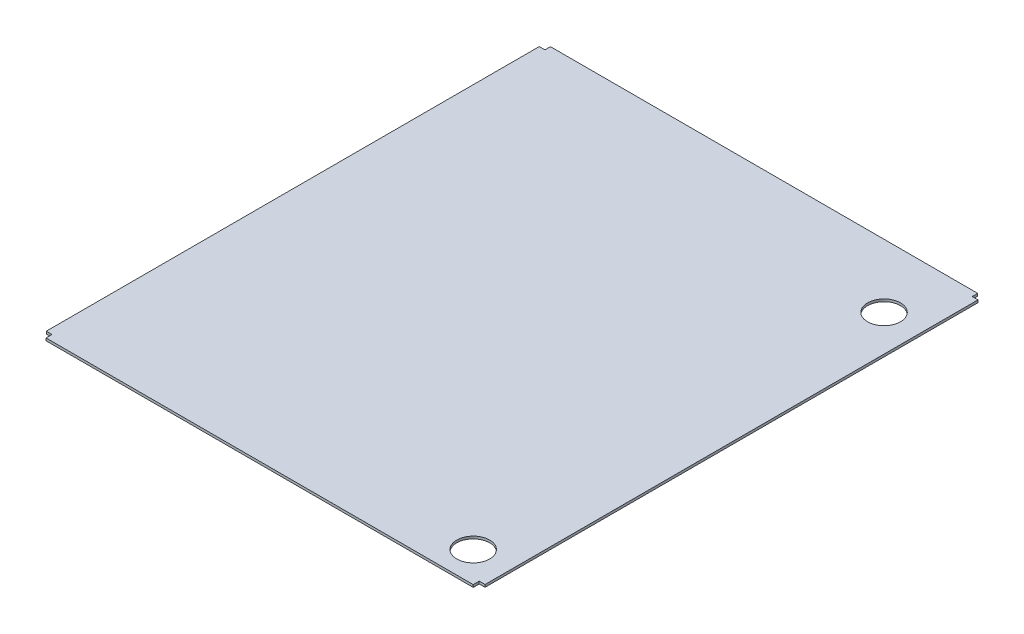
ISO-10303-21;
HEADER;
FILE_DESCRIPTION(('STEP AP214'),'2;1');
FILE_NAME('part.step','',(''),(''),'','','');
FILE_SCHEMA(('AUTOMOTIVE_DESIGN { 1 0 10303 214 1 1 1 1 }'));
ENDSEC;
DATA;
#1=APPLICATION_CONTEXT('core data for automotive mechanical design processes');
#2=APPLICATION_PROTOCOL_DEFINITION('international standard','automotive_design',2000,#1);
#3=PRODUCT_CONTEXT('',#1,'mechanical');
#4=PRODUCT('Part','Part','',(#3));
#5=PRODUCT_RELATED_PRODUCT_CATEGORY('part','',(#4));
#6=PRODUCT_DEFINITION_FORMATION('','',#4);
#7=PRODUCT_DEFINITION_CONTEXT('part definition',#1,'design');
#8=PRODUCT_DEFINITION('design','',#6,#7);
#9=PRODUCT_DEFINITION_SHAPE('','',#8);
#10=(LENGTH_UNIT() NAMED_UNIT(*) SI_UNIT(.MILLI.,.METRE.));
#11=(NAMED_UNIT(*) PLANE_ANGLE_UNIT() SI_UNIT($,.RADIAN.));
#12=(NAMED_UNIT(*) SI_UNIT($,.STERADIAN.) SOLID_ANGLE_UNIT());
#13=UNCERTAINTY_MEASURE_WITH_UNIT(LENGTH_MEASURE(1.E-05),#10,'distance_accuracy_value','');
#14=(GEOMETRIC_REPRESENTATION_CONTEXT(3) GLOBAL_UNCERTAINTY_ASSIGNED_CONTEXT((#13)) GLOBAL_UNIT_ASSIGNED_CONTEXT((#10,
#11,#12)) REPRESENTATION_CONTEXT('',''));
#15=CARTESIAN_POINT('',(0.,0.,0.));
#16=DIRECTION('',(0.,0.,1.));
#17=DIRECTION('',(1.,0.,0.));
#18=AXIS2_PLACEMENT_3D('',#15,#16,#17);
#19=CARTESIAN_POINT('',(0.0465208544824236,3.,-0.291126182503376));
#20=DIRECTION('',(0.,0.,-1.));
#21=DIRECTION('',(-1.,0.,0.));
#22=AXIS2_PLACEMENT_3D('',#19,#20,#21);
#23=PLANE('',#22);
#24=DIRECTION('',(0.,-1.,0.));
#25=VECTOR('',#24,1.);
#26=CARTESIAN_POINT('',(7.00000000000001,3.,-0.291126182503376));
#27=LINE('',#26,#25);
#28=CARTESIAN_POINT('',(6.99999999999996,3.,-0.291126182503376));
#29=VERTEX_POINT('',#28);
#30=CARTESIAN_POINT('',(6.99999999999996,0.,-0.291126182503376));
#31=VERTEX_POINT('',#30);
#32=EDGE_CURVE('E163',#29,#31,#27,.T.);
#33=ORIENTED_EDGE('',*,*,#32,.F.);
#34=DIRECTION('',(1.,0.,0.));
#35=VECTOR('',#34,1.);
#36=CARTESIAN_POINT('',(0.0465208544824236,3.,-0.291126182503376));
#37=LINE('',#36,#35);
#38=CARTESIAN_POINT('',(0.0465208544824236,3.,-0.291126182503376));
#39=VERTEX_POINT('',#38);
#40=EDGE_CURVE('E132',#39,#29,#37,.T.);
#41=ORIENTED_EDGE('',*,*,#40,.F.);
#42=DIRECTION('',(0.,-1.,0.));
#43=VECTOR('',#42,1.);
#44=CARTESIAN_POINT('',(0.0465208544824236,3.,-0.291126182503376));
#45=LINE('',#44,#43);
#46=CARTESIAN_POINT('',(0.0465208544824236,0.,-0.291126182503376));
#47=VERTEX_POINT('',#46);
#48=EDGE_CURVE('E11',#39,#47,#45,.T.);
#49=ORIENTED_EDGE('',*,*,#48,.T.);
#50=DIRECTION('',(1.,0.,0.));
#51=VECTOR('',#50,1.);
#52=CARTESIAN_POINT('',(0.0465208544824236,0.,-0.291126182503376));
#53=LINE('',#52,#51);
#54=EDGE_CURVE('E179',#47,#31,#53,.T.);
#55=ORIENTED_EDGE('',*,*,#54,.T.);
#56=EDGE_LOOP('',(#33,#41,#49,#55));
#57=FACE_BOUND('',#56,.T.);
#58=ADVANCED_FACE('F33',(#57),#23,.F.);
#59=DIRECTION('',(0.,1.,0.));
#60=VECTOR('',#59,1.);
#61=CARTESIAN_POINT('',(527.,3.,-0.291126182503376));
#62=LINE('',#61,#60);
#63=CARTESIAN_POINT('',(527.,0.,-0.291126182503376));
#64=VERTEX_POINT('',#63);
#65=CARTESIAN_POINT('',(527.,3.,-0.291126182503376));
#66=VERTEX_POINT('',#65);
#67=EDGE_CURVE('E153',#64,#66,#62,.T.);
#68=ORIENTED_EDGE('',*,*,#67,.F.);
#69=CARTESIAN_POINT('',(534.046520854482,0.,-0.291126182503376));
#70=VERTEX_POINT('',#69);
#71=EDGE_CURVE('E178',#64,#70,#53,.T.);
#72=ORIENTED_EDGE('',*,*,#71,.T.);
#73=DIRECTION('',(0.,-1.,0.));
#74=VECTOR('',#73,1.);
#75=CARTESIAN_POINT('',(534.046520854482,3.,-0.291126182503376));
#76=LINE('',#75,#74);
#77=CARTESIAN_POINT('',(534.046520854482,3.,-0.291126182503376));
#78=VERTEX_POINT('',#77);
#79=EDGE_CURVE('E42',#78,#70,#76,.T.);
#80=ORIENTED_EDGE('',*,*,#79,.F.);
#81=EDGE_CURVE('E168',#66,#78,#37,.T.);
#82=ORIENTED_EDGE('',*,*,#81,.F.);
#83=EDGE_LOOP('',(#68,#72,#80,#82));
#84=FACE_BOUND('',#83,.T.);
#85=ADVANCED_FACE('F273',(#84),#23,.F.);
#86=CARTESIAN_POINT('',(0.0465208544824236,3.,-600.291126182503));
#87=DIRECTION('',(0.,0.,1.));
#88=DIRECTION('',(1.,0.,0.));
#89=AXIS2_PLACEMENT_3D('',#86,#87,#88);
#90=PLANE('',#89);
#91=DIRECTION('',(0.,1.,0.));
#92=VECTOR('',#91,1.);
#93=CARTESIAN_POINT('',(6.99999999999992,3.,-600.291126182503));
#94=LINE('',#93,#92);
#95=CARTESIAN_POINT('',(6.99999999999992,0.,-600.291126182503));
#96=VERTEX_POINT('',#95);
#97=CARTESIAN_POINT('',(6.99999999999996,3.,-600.291126182503));
#98=VERTEX_POINT('',#97);
#99=EDGE_CURVE('E161',#96,#98,#94,.T.);
#100=ORIENTED_EDGE('',*,*,#99,.F.);
#101=DIRECTION('',(-1.,0.,0.));
#102=VECTOR('',#101,1.);
#103=CARTESIAN_POINT('',(0.0465208544824236,0.,-600.291126182503));
#104=LINE('',#103,#102);
#105=CARTESIAN_POINT('',(0.0465208544824236,0.,-600.291126182503));
#106=VERTEX_POINT('',#105);
#107=EDGE_CURVE('E183',#96,#106,#104,.T.);
#108=ORIENTED_EDGE('',*,*,#107,.T.);
#109=DIRECTION('',(0.,-1.,0.));
#110=VECTOR('',#109,1.);
#111=CARTESIAN_POINT('',(0.0465208544824236,3.,-600.291126182503));
#112=LINE('',#111,#110);
#113=CARTESIAN_POINT('',(0.0465208544824236,3.,-600.291126182503));
#114=VERTEX_POINT('',#113);
#115=EDGE_CURVE('E175',#114,#106,#112,.T.);
#116=ORIENTED_EDGE('',*,*,#115,.F.);
#117=DIRECTION('',(-1.,0.,0.));
#118=VECTOR('',#117,1.);
#119=CARTESIAN_POINT('',(0.0465208544824236,3.,-600.291126182503));
#120=LINE('',#119,#118);
#121=EDGE_CURVE('E49',#98,#114,#120,.T.);
#122=ORIENTED_EDGE('',*,*,#121,.F.);
#123=EDGE_LOOP('',(#100,#108,#116,#122));
#124=FACE_BOUND('',#123,.T.);
#125=ADVANCED_FACE('F278',(#124),#90,.F.);
#126=DIRECTION('',(0.,-1.,0.));
#127=VECTOR('',#126,1.);
#128=CARTESIAN_POINT('',(527.,3.,-600.291126182503));
#129=LINE('',#128,#127);
#130=CARTESIAN_POINT('',(527.,3.,-600.291126182503));
#131=VERTEX_POINT('',#130);
#132=CARTESIAN_POINT('',(527.,0.,-600.291126182503));
#133=VERTEX_POINT('',#132);
#134=EDGE_CURVE('E57',#131,#133,#129,.T.);
#135=ORIENTED_EDGE('',*,*,#134,.F.);
#136=CARTESIAN_POINT('',(534.046520854482,3.,-600.291126182503));
#137=VERTEX_POINT('',#136);
#138=EDGE_CURVE('E173',#137,#131,#120,.T.);
#139=ORIENTED_EDGE('',*,*,#138,.F.);
#140=DIRECTION('',(0.,-1.,0.));
#141=VECTOR('',#140,1.);
#142=CARTESIAN_POINT('',(534.046520854482,3.,-600.291126182503));
#143=LINE('',#142,#141);
#144=CARTESIAN_POINT('',(534.046520854482,0.,-600.291126182503));
#145=VERTEX_POINT('',#144);
#146=EDGE_CURVE('E187',#137,#145,#143,.T.);
#147=ORIENTED_EDGE('',*,*,#146,.T.);
#148=EDGE_CURVE('E169',#145,#133,#104,.T.);
#149=ORIENTED_EDGE('',*,*,#148,.T.);
#150=EDGE_LOOP('',(#135,#139,#147,#149));
#151=FACE_BOUND('',#150,.T.);
#152=ADVANCED_FACE('F206',(#151),#90,.F.);
#153=CARTESIAN_POINT('',(0.0465208544824236,3.,-0.291126182503376));
#154=DIRECTION('',(1.,0.,0.));
#155=DIRECTION('',(0.,0.,-1.));
#156=AXIS2_PLACEMENT_3D('',#153,#154,#155);
#157=PLANE('',#156);
#158=DIRECTION('',(0.,0.,1.));
#159=VECTOR('',#158,1.);
#160=CARTESIAN_POINT('',(0.0465208544824236,0.,-0.291126182503376));
#161=LINE('',#160,#159);
#162=EDGE_CURVE('E165',#106,#47,#161,.T.);
#163=ORIENTED_EDGE('',*,*,#162,.T.);
#164=ORIENTED_EDGE('',*,*,#48,.F.);
#165=DIRECTION('',(0.,0.,1.));
#166=VECTOR('',#165,1.);
#167=CARTESIAN_POINT('',(0.0465208544824236,3.,-0.291126182503376));
#168=LINE('',#167,#166);
#169=EDGE_CURVE('E166',#114,#39,#168,.T.);
#170=ORIENTED_EDGE('',*,*,#169,.F.);
#171=ORIENTED_EDGE('',*,*,#115,.T.);
#172=EDGE_LOOP('',(#163,#164,#170,#171));
#173=FACE_BOUND('',#172,.T.);
#174=ADVANCED_FACE('F35',(#173),#157,.F.);
#175=CARTESIAN_POINT('',(534.046520854482,3.,-0.291126182503376));
#176=DIRECTION('',(-1.,0.,0.));
#177=DIRECTION('',(0.,0.,1.));
#178=AXIS2_PLACEMENT_3D('',#175,#176,#177);
#179=PLANE('',#178);
#180=DIRECTION('',(0.,0.,-1.));
#181=VECTOR('',#180,1.);
#182=CARTESIAN_POINT('',(534.046520854482,0.,-0.291126182503376));
#183=LINE('',#182,#181);
#184=EDGE_CURVE('E181',#70,#145,#183,.T.);
#185=ORIENTED_EDGE('',*,*,#184,.T.);
#186=ORIENTED_EDGE('',*,*,#146,.F.);
#187=DIRECTION('',(0.,0.,-1.));
#188=VECTOR('',#187,1.);
#189=CARTESIAN_POINT('',(534.046520854482,3.,-0.291126182503376));
#190=LINE('',#189,#188);
#191=EDGE_CURVE('E171',#78,#137,#190,.T.);
#192=ORIENTED_EDGE('',*,*,#191,.F.);
#193=ORIENTED_EDGE('',*,*,#79,.T.);
#194=EDGE_LOOP('',(#185,#186,#192,#193));
#195=FACE_BOUND('',#194,.T.);
#196=ADVANCED_FACE('F195',(#195),#179,.F.);
#197=CARTESIAN_POINT('',(0.,3.,0.));
#198=DIRECTION('',(0.,-1.,0.));
#199=DIRECTION('',(0.,0.,-1.));
#200=AXIS2_PLACEMENT_3D('',#197,#198,#199);
#201=PLANE('',#200);
#202=CARTESIAN_POINT('',(490.,3.,-30.));
#203=DIRECTION('',(0.,-1.,0.));
#204=DIRECTION('',(0.,0.,-1.));
#205=AXIS2_PLACEMENT_3D('',#202,#203,#204);
#206=CIRCLE('',#205,20.);
#207=CARTESIAN_POINT('',(490.,3.,-50.));
#208=VERTEX_POINT('',#207);
#209=EDGE_CURVE('E242',#208,#208,#206,.T.);
#210=ORIENTED_EDGE('',*,*,#209,.T.);
#211=EDGE_LOOP('',(#210));
#212=FACE_BOUND('',#211,.T.);
#213=CARTESIAN_POINT('',(490.,3.,-530.));
#214=DIRECTION('',(0.,1.,0.));
#215=DIRECTION('',(0.,0.,1.));
#216=AXIS2_PLACEMENT_3D('',#213,#214,#215);
#217=CIRCLE('',#216,20.);
#218=CARTESIAN_POINT('',(490.,3.,-510.));
#219=VERTEX_POINT('',#218);
#220=EDGE_CURVE('E239',#219,#219,#217,.T.);
#221=ORIENTED_EDGE('',*,*,#220,.F.);
#222=EDGE_LOOP('',(#221));
#223=FACE_BOUND('',#222,.T.);
#224=ORIENTED_EDGE('',*,*,#138,.T.);
#225=DIRECTION('',(0.,0.,-1.));
#226=VECTOR('',#225,1.);
#227=CARTESIAN_POINT('',(527.,3.,-607.));
#228=LINE('',#227,#226);
#229=CARTESIAN_POINT('',(527.,3.,-607.));
#230=VERTEX_POINT('',#229);
#231=EDGE_CURVE('E146',#131,#230,#228,.T.);
#232=ORIENTED_EDGE('',*,*,#231,.T.);
#233=DIRECTION('',(-1.,0.,0.));
#234=VECTOR('',#233,1.);
#235=CARTESIAN_POINT('',(6.99999999999992,3.,-607.));
#236=LINE('',#235,#234);
#237=CARTESIAN_POINT('',(6.99999999999992,3.,-607.));
#238=VERTEX_POINT('',#237);
#239=EDGE_CURVE('E215',#230,#238,#236,.T.);
#240=ORIENTED_EDGE('',*,*,#239,.T.);
#241=DIRECTION('',(0.,0.,1.));
#242=VECTOR('',#241,1.);
#243=CARTESIAN_POINT('',(6.99999999999992,3.,-607.));
#244=LINE('',#243,#242);
#245=EDGE_CURVE('E136',#238,#98,#244,.T.);
#246=ORIENTED_EDGE('',*,*,#245,.T.);
#247=ORIENTED_EDGE('',*,*,#121,.T.);
#248=ORIENTED_EDGE('',*,*,#169,.T.);
#249=ORIENTED_EDGE('',*,*,#40,.T.);
#250=CARTESIAN_POINT('',(7.00000000000001,3.,7.));
#251=VERTEX_POINT('',#250);
#252=EDGE_CURVE('E125',#29,#251,#244,.T.);
#253=ORIENTED_EDGE('',*,*,#252,.T.);
#254=DIRECTION('',(1.,0.,0.));
#255=VECTOR('',#254,1.);
#256=CARTESIAN_POINT('',(7.00000000000001,3.,7.));
#257=LINE('',#256,#255);
#258=CARTESIAN_POINT('',(527.,3.,7.));
#259=VERTEX_POINT('',#258);
#260=EDGE_CURVE('E129',#251,#259,#257,.T.);
#261=ORIENTED_EDGE('',*,*,#260,.T.);
#262=EDGE_CURVE('E213',#259,#66,#228,.T.);
#263=ORIENTED_EDGE('',*,*,#262,.T.);
#264=ORIENTED_EDGE('',*,*,#81,.T.);
#265=ORIENTED_EDGE('',*,*,#191,.T.);
#266=EDGE_LOOP('',(#224,#232,#240,#246,#247,#248,#249,#253,#261,#263,#264,#265));
#267=FACE_BOUND('',#266,.T.);
#268=ADVANCED_FACE('F127',(#212,#223,#267),#201,.F.);
#269=CARTESIAN_POINT('',(0.,0.,0.));
#270=DIRECTION('',(0.,-1.,0.));
#271=DIRECTION('',(0.,0.,-1.));
#272=AXIS2_PLACEMENT_3D('',#269,#270,#271);
#273=PLANE('',#272);
#274=CARTESIAN_POINT('',(490.,0.,-30.));
#275=DIRECTION('',(0.,-1.,0.));
#276=DIRECTION('',(0.,0.,-1.));
#277=AXIS2_PLACEMENT_3D('',#274,#275,#276);
#278=CIRCLE('',#277,20.);
#279=CARTESIAN_POINT('',(490.,0.,-50.));
#280=VERTEX_POINT('',#279);
#281=EDGE_CURVE('E245',#280,#280,#278,.T.);
#282=ORIENTED_EDGE('',*,*,#281,.F.);
#283=EDGE_LOOP('',(#282));
#284=FACE_BOUND('',#283,.T.);
#285=CARTESIAN_POINT('',(490.,0.,-530.));
#286=DIRECTION('',(0.,-1.,0.));
#287=DIRECTION('',(0.,0.,-1.));
#288=AXIS2_PLACEMENT_3D('',#285,#286,#287);
#289=CIRCLE('',#288,20.);
#290=CARTESIAN_POINT('',(490.,0.,-550.));
#291=VERTEX_POINT('',#290);
#292=EDGE_CURVE('E37',#291,#291,#289,.T.);
#293=ORIENTED_EDGE('',*,*,#292,.F.);
#294=EDGE_LOOP('',(#293));
#295=FACE_BOUND('',#294,.T.);
#296=ORIENTED_EDGE('',*,*,#71,.F.);
#297=DIRECTION('',(0.,0.,-1.));
#298=VECTOR('',#297,1.);
#299=CARTESIAN_POINT('',(527.,0.,-607.));
#300=LINE('',#299,#298);
#301=CARTESIAN_POINT('',(527.,0.,7.));
#302=VERTEX_POINT('',#301);
#303=EDGE_CURVE('E224',#302,#64,#300,.T.);
#304=ORIENTED_EDGE('',*,*,#303,.F.);
#305=DIRECTION('',(1.,0.,0.));
#306=VECTOR('',#305,1.);
#307=CARTESIAN_POINT('',(7.00000000000001,0.,7.));
#308=LINE('',#307,#306);
#309=CARTESIAN_POINT('',(7.00000000000001,0.,7.));
#310=VERTEX_POINT('',#309);
#311=EDGE_CURVE('E222',#310,#302,#308,.T.);
#312=ORIENTED_EDGE('',*,*,#311,.F.);
#313=DIRECTION('',(0.,0.,1.));
#314=VECTOR('',#313,1.);
#315=CARTESIAN_POINT('',(6.99999999999992,0.,-607.));
#316=LINE('',#315,#314);
#317=EDGE_CURVE('E150',#31,#310,#316,.T.);
#318=ORIENTED_EDGE('',*,*,#317,.F.);
#319=ORIENTED_EDGE('',*,*,#54,.F.);
#320=ORIENTED_EDGE('',*,*,#162,.F.);
#321=ORIENTED_EDGE('',*,*,#107,.F.);
#322=CARTESIAN_POINT('',(6.99999999999992,0.,-607.));
#323=VERTEX_POINT('',#322);
#324=EDGE_CURVE('E219',#323,#96,#316,.T.);
#325=ORIENTED_EDGE('',*,*,#324,.F.);
#326=DIRECTION('',(-1.,0.,0.));
#327=VECTOR('',#326,1.);
#328=CARTESIAN_POINT('',(6.99999999999992,0.,-607.));
#329=LINE('',#328,#327);
#330=CARTESIAN_POINT('',(527.,0.,-607.));
#331=VERTEX_POINT('',#330);
#332=EDGE_CURVE('E137',#331,#323,#329,.T.);
#333=ORIENTED_EDGE('',*,*,#332,.F.);
#334=EDGE_CURVE('E205',#133,#331,#300,.T.);
#335=ORIENTED_EDGE('',*,*,#334,.F.);
#336=ORIENTED_EDGE('',*,*,#148,.F.);
#337=ORIENTED_EDGE('',*,*,#184,.F.);
#338=EDGE_LOOP('',(#296,#304,#312,#318,#319,#320,#321,#325,#333,#335,#336,#337));
#339=FACE_BOUND('',#338,.T.);
#340=ADVANCED_FACE('F200',(#284,#295,#339),#273,.T.);
#341=CARTESIAN_POINT('',(6.99999999999992,3.,-607.));
#342=DIRECTION('',(0.,0.,1.));
#343=DIRECTION('',(1.,0.,0.));
#344=AXIS2_PLACEMENT_3D('',#341,#342,#343);
#345=PLANE('',#344);
#346=ORIENTED_EDGE('',*,*,#332,.T.);
#347=DIRECTION('',(0.,-1.,0.));
#348=VECTOR('',#347,1.);
#349=CARTESIAN_POINT('',(6.99999999999992,3.,-607.));
#350=LINE('',#349,#348);
#351=EDGE_CURVE('E218',#238,#323,#350,.T.);
#352=ORIENTED_EDGE('',*,*,#351,.F.);
#353=ORIENTED_EDGE('',*,*,#239,.F.);
#354=DIRECTION('',(0.,-1.,0.));
#355=VECTOR('',#354,1.);
#356=CARTESIAN_POINT('',(527.,3.,-607.));
#357=LINE('',#356,#355);
#358=EDGE_CURVE('E155',#230,#331,#357,.T.);
#359=ORIENTED_EDGE('',*,*,#358,.T.);
#360=EDGE_LOOP('',(#346,#352,#353,#359));
#361=FACE_BOUND('',#360,.T.);
#362=ADVANCED_FACE('F230',(#361),#345,.F.);
#363=CARTESIAN_POINT('',(527.,3.,-607.));
#364=DIRECTION('',(-1.,0.,0.));
#365=DIRECTION('',(0.,0.,1.));
#366=AXIS2_PLACEMENT_3D('',#363,#364,#365);
#367=PLANE('',#366);
#368=ORIENTED_EDGE('',*,*,#231,.F.);
#369=ORIENTED_EDGE('',*,*,#134,.T.);
#370=ORIENTED_EDGE('',*,*,#334,.T.);
#371=ORIENTED_EDGE('',*,*,#358,.F.);
#372=EDGE_LOOP('',(#368,#369,#370,#371));
#373=FACE_BOUND('',#372,.T.);
#374=ADVANCED_FACE('F209',(#373),#367,.F.);
#375=CARTESIAN_POINT('',(6.99999999999992,3.,-607.));
#376=DIRECTION('',(1.,0.,0.));
#377=DIRECTION('',(0.,0.,-1.));
#378=AXIS2_PLACEMENT_3D('',#375,#376,#377);
#379=PLANE('',#378);
#380=ORIENTED_EDGE('',*,*,#324,.T.);
#381=ORIENTED_EDGE('',*,*,#99,.T.);
#382=ORIENTED_EDGE('',*,*,#245,.F.);
#383=ORIENTED_EDGE('',*,*,#351,.T.);
#384=EDGE_LOOP('',(#380,#381,#382,#383));
#385=FACE_BOUND('',#384,.T.);
#386=ADVANCED_FACE('F235',(#385),#379,.F.);
#387=ORIENTED_EDGE('',*,*,#252,.F.);
#388=ORIENTED_EDGE('',*,*,#32,.T.);
#389=ORIENTED_EDGE('',*,*,#317,.T.);
#390=DIRECTION('',(0.,-1.,0.));
#391=VECTOR('',#390,1.);
#392=CARTESIAN_POINT('',(7.00000000000001,3.,7.));
#393=LINE('',#392,#391);
#394=EDGE_CURVE('E142',#251,#310,#393,.T.);
#395=ORIENTED_EDGE('',*,*,#394,.F.);
#396=EDGE_LOOP('',(#387,#388,#389,#395));
#397=FACE_BOUND('',#396,.T.);
#398=ADVANCED_FACE('F148',(#397),#379,.F.);
#399=ORIENTED_EDGE('',*,*,#303,.T.);
#400=ORIENTED_EDGE('',*,*,#67,.T.);
#401=ORIENTED_EDGE('',*,*,#262,.F.);
#402=DIRECTION('',(0.,-1.,0.));
#403=VECTOR('',#402,1.);
#404=CARTESIAN_POINT('',(527.,3.,7.));
#405=LINE('',#404,#403);
#406=EDGE_CURVE('E144',#259,#302,#405,.T.);
#407=ORIENTED_EDGE('',*,*,#406,.T.);
#408=EDGE_LOOP('',(#399,#400,#401,#407));
#409=FACE_BOUND('',#408,.T.);
#410=ADVANCED_FACE('F288',(#409),#367,.F.);
#411=CARTESIAN_POINT('',(7.00000000000001,3.,7.));
#412=DIRECTION('',(0.,0.,-1.));
#413=DIRECTION('',(-1.,0.,0.));
#414=AXIS2_PLACEMENT_3D('',#411,#412,#413);
#415=PLANE('',#414);
#416=ORIENTED_EDGE('',*,*,#311,.T.);
#417=ORIENTED_EDGE('',*,*,#406,.F.);
#418=ORIENTED_EDGE('',*,*,#260,.F.);
#419=ORIENTED_EDGE('',*,*,#394,.T.);
#420=EDGE_LOOP('',(#416,#417,#418,#419));
#421=FACE_BOUND('',#420,.T.);
#422=ADVANCED_FACE('F141',(#421),#415,.F.);
#423=CARTESIAN_POINT('',(490.,-7.,-530.));
#424=DIRECTION('',(0.,1.,0.));
#425=DIRECTION('',(0.,0.,1.));
#426=AXIS2_PLACEMENT_3D('',#423,#424,#425);
#427=CYLINDRICAL_SURFACE('',#426,20.);
#428=ORIENTED_EDGE('',*,*,#292,.T.);
#429=EDGE_LOOP('',(#428));
#430=FACE_BOUND('',#429,.T.);
#431=ORIENTED_EDGE('',*,*,#220,.T.);
#432=EDGE_LOOP('',(#431));
#433=FACE_BOUND('',#432,.T.);
#434=ADVANCED_FACE('F258',(#430,#433),#427,.F.);
#435=CARTESIAN_POINT('',(490.,10.,-30.));
#436=DIRECTION('',(0.,-1.,0.));
#437=DIRECTION('',(0.,0.,-1.));
#438=AXIS2_PLACEMENT_3D('',#435,#436,#437);
#439=CYLINDRICAL_SURFACE('',#438,20.);
#440=ORIENTED_EDGE('',*,*,#281,.T.);
#441=EDGE_LOOP('',(#440));
#442=FACE_BOUND('',#441,.T.);
#443=ORIENTED_EDGE('',*,*,#209,.F.);
#444=EDGE_LOOP('',(#443));
#445=FACE_BOUND('',#444,.T.);
#446=ADVANCED_FACE('F249',(#442,#445),#439,.F.);
#447=CLOSED_SHELL('',(#58,#85,#125,#152,#174,#196,#268,#340,#362,#374,#386,#398,#410,#422,#434,#446));
#448=MANIFOLD_SOLID_BREP('B2',#447);
#449=ADVANCED_BREP_SHAPE_REPRESENTATION('',(#18,#448),#14);
#450=SHAPE_DEFINITION_REPRESENTATION(#9,#449);
ENDSEC;
END-ISO-10303-21;
